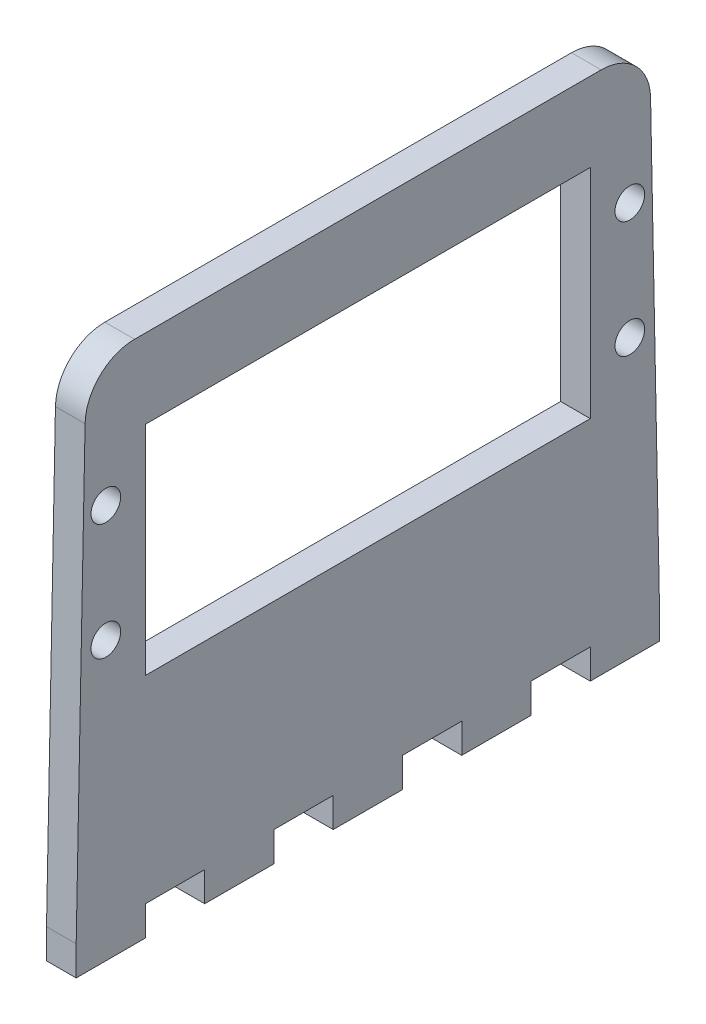
ISO-10303-21;
HEADER;
FILE_DESCRIPTION(('STEP AP214'),'2;1');
FILE_NAME('part.step','',(''),(''),'','','');
FILE_SCHEMA(('AUTOMOTIVE_DESIGN { 1 0 10303 214 1 1 1 1 }'));
ENDSEC;
DATA;
#1=APPLICATION_CONTEXT('core data for automotive mechanical design processes');
#2=APPLICATION_PROTOCOL_DEFINITION('international standard','automotive_design',2000,#1);
#3=PRODUCT_CONTEXT('',#1,'mechanical');
#4=PRODUCT('Part','Part','',(#3));
#5=PRODUCT_RELATED_PRODUCT_CATEGORY('part','',(#4));
#6=PRODUCT_DEFINITION_FORMATION('','',#4);
#7=PRODUCT_DEFINITION_CONTEXT('part definition',#1,'design');
#8=PRODUCT_DEFINITION('design','',#6,#7);
#9=PRODUCT_DEFINITION_SHAPE('','',#8);
#10=(LENGTH_UNIT() NAMED_UNIT(*) SI_UNIT(.MILLI.,.METRE.));
#11=(NAMED_UNIT(*) PLANE_ANGLE_UNIT() SI_UNIT($,.RADIAN.));
#12=(NAMED_UNIT(*) SI_UNIT($,.STERADIAN.) SOLID_ANGLE_UNIT());
#13=UNCERTAINTY_MEASURE_WITH_UNIT(LENGTH_MEASURE(1.E-05),#10,'distance_accuracy_value','');
#14=(GEOMETRIC_REPRESENTATION_CONTEXT(3) GLOBAL_UNCERTAINTY_ASSIGNED_CONTEXT((#13)) GLOBAL_UNIT_ASSIGNED_CONTEXT((#10,
#11,#12)) REPRESENTATION_CONTEXT('',''));
#15=CARTESIAN_POINT('',(0.,0.,0.));
#16=DIRECTION('',(0.,0.,1.));
#17=DIRECTION('',(1.,0.,0.));
#18=AXIS2_PLACEMENT_3D('',#15,#16,#17);
#19=CARTESIAN_POINT('',(3.,0.,0.));
#20=DIRECTION('',(-1.,0.,0.));
#21=DIRECTION('',(0.,0.,1.));
#22=AXIS2_PLACEMENT_3D('',#19,#20,#21);
#23=PLANE('',#22);
#24=DIRECTION('',(0.,0.,1.));
#25=VECTOR('',#24,1.);
#26=CARTESIAN_POINT('',(3.,50.,32.));
#27=LINE('',#26,#25);
#28=CARTESIAN_POINT('',(3.,50.,-20.09900009998));
#29=VERTEX_POINT('',#28);
#30=CARTESIAN_POINT('',(3.,50.,27.09900009998));
#31=VERTEX_POINT('',#30);
#32=EDGE_CURVE('E307',#29,#31,#27,.T.);
#33=ORIENTED_EDGE('',*,*,#32,.T.);
#34=CARTESIAN_POINT('',(3.,45.,27.09900009998));
#35=DIRECTION('',(-1.,0.,0.));
#36=DIRECTION('',(0.,0.,1.));
#37=AXIS2_PLACEMENT_3D('',#34,#35,#36);
#38=CIRCLE('',#37,5.);
#39=CARTESIAN_POINT('',(3.,45.099980005998,32.0980003998801));
#40=VERTEX_POINT('',#39);
#41=EDGE_CURVE('E41',#31,#40,#38,.F.);
#42=ORIENTED_EDGE('',*,*,#41,.T.);
#43=DIRECTION('',(0.,-0.999800059980007,0.0199960011996028));
#44=VECTOR('',#43,1.);
#45=CARTESIAN_POINT('',(3.,0.,33.0000000000001));
#46=LINE('',#45,#44);
#47=CARTESIAN_POINT('',(3.,0.,33.0000000000001));
#48=VERTEX_POINT('',#47);
#49=EDGE_CURVE('E309',#40,#48,#46,.T.);
#50=ORIENTED_EDGE('',*,*,#49,.T.);
#51=DIRECTION('',(0.,-1.,0.));
#52=VECTOR('',#51,1.);
#53=CARTESIAN_POINT('',(3.,-3.,33.0000000000001));
#54=LINE('',#53,#52);
#55=CARTESIAN_POINT('',(3.,-3.,33.0000000000001));
#56=VERTEX_POINT('',#55);
#57=EDGE_CURVE('E265',#48,#56,#54,.T.);
#58=ORIENTED_EDGE('',*,*,#57,.T.);
#59=DIRECTION('',(0.,0.,-1.));
#60=VECTOR('',#59,1.);
#61=CARTESIAN_POINT('',(3.,-3.,26.0000000000001));
#62=LINE('',#61,#60);
#63=CARTESIAN_POINT('',(3.,-3.,26.0000000000001));
#64=VERTEX_POINT('',#63);
#65=EDGE_CURVE('E268',#56,#64,#62,.T.);
#66=ORIENTED_EDGE('',*,*,#65,.T.);
#67=DIRECTION('',(0.,1.,0.));
#68=VECTOR('',#67,1.);
#69=CARTESIAN_POINT('',(3.,0.,26.0000000000001));
#70=LINE('',#69,#68);
#71=CARTESIAN_POINT('',(3.,0.,26.0000000000001));
#72=VERTEX_POINT('',#71);
#73=EDGE_CURVE('E271',#64,#72,#70,.T.);
#74=ORIENTED_EDGE('',*,*,#73,.T.);
#75=DIRECTION('',(0.,0.,-1.));
#76=VECTOR('',#75,1.);
#77=CARTESIAN_POINT('',(3.,0.,20.0000000000001));
#78=LINE('',#77,#76);
#79=CARTESIAN_POINT('',(3.,0.,20.0000000000001));
#80=VERTEX_POINT('',#79);
#81=EDGE_CURVE('E273',#72,#80,#78,.T.);
#82=ORIENTED_EDGE('',*,*,#81,.T.);
#83=DIRECTION('',(0.,-1.,0.));
#84=VECTOR('',#83,1.);
#85=CARTESIAN_POINT('',(3.,-3.,20.0000000000001));
#86=LINE('',#85,#84);
#87=CARTESIAN_POINT('',(3.,-3.,20.0000000000001));
#88=VERTEX_POINT('',#87);
#89=EDGE_CURVE('E275',#80,#88,#86,.T.);
#90=ORIENTED_EDGE('',*,*,#89,.T.);
#91=DIRECTION('',(0.,0.,-1.));
#92=VECTOR('',#91,1.);
#93=CARTESIAN_POINT('',(3.,-3.,13.0000000000001));
#94=LINE('',#93,#92);
#95=CARTESIAN_POINT('',(3.,-3.,13.0000000000001));
#96=VERTEX_POINT('',#95);
#97=EDGE_CURVE('E277',#88,#96,#94,.T.);
#98=ORIENTED_EDGE('',*,*,#97,.T.);
#99=DIRECTION('',(0.,1.,0.));
#100=VECTOR('',#99,1.);
#101=CARTESIAN_POINT('',(3.,0.,13.0000000000001));
#102=LINE('',#101,#100);
#103=CARTESIAN_POINT('',(3.,0.,13.0000000000001));
#104=VERTEX_POINT('',#103);
#105=EDGE_CURVE('E279',#96,#104,#102,.T.);
#106=ORIENTED_EDGE('',*,*,#105,.T.);
#107=DIRECTION('',(0.,0.,-1.));
#108=VECTOR('',#107,1.);
#109=CARTESIAN_POINT('',(3.,0.,7.00000000000027));
#110=LINE('',#109,#108);
#111=CARTESIAN_POINT('',(3.,0.,7.00000000000027));
#112=VERTEX_POINT('',#111);
#113=EDGE_CURVE('E281',#104,#112,#110,.T.);
#114=ORIENTED_EDGE('',*,*,#113,.T.);
#115=DIRECTION('',(0.,-1.,0.));
#116=VECTOR('',#115,1.);
#117=CARTESIAN_POINT('',(3.,-3.,7.00000000000018));
#118=LINE('',#117,#116);
#119=CARTESIAN_POINT('',(3.,-3.,7.00000000000018));
#120=VERTEX_POINT('',#119);
#121=EDGE_CURVE('E283',#112,#120,#118,.T.);
#122=ORIENTED_EDGE('',*,*,#121,.T.);
#123=DIRECTION('',(0.,0.,-1.));
#124=VECTOR('',#123,1.);
#125=CARTESIAN_POINT('',(3.,-3.,0.));
#126=LINE('',#125,#124);
#127=CARTESIAN_POINT('',(3.,-3.,0.));
#128=VERTEX_POINT('',#127);
#129=EDGE_CURVE('E285',#120,#128,#126,.T.);
#130=ORIENTED_EDGE('',*,*,#129,.T.);
#131=DIRECTION('',(0.,1.,0.));
#132=VECTOR('',#131,1.);
#133=CARTESIAN_POINT('',(3.,0.,0.));
#134=LINE('',#133,#132);
#135=CARTESIAN_POINT('',(3.,0.,0.));
#136=VERTEX_POINT('',#135);
#137=EDGE_CURVE('E287',#128,#136,#134,.T.);
#138=ORIENTED_EDGE('',*,*,#137,.T.);
#139=DIRECTION('',(0.,0.,-1.));
#140=VECTOR('',#139,1.);
#141=CARTESIAN_POINT('',(3.,0.,-6.00000000000001));
#142=LINE('',#141,#140);
#143=CARTESIAN_POINT('',(3.,0.,-6.00000000000001));
#144=VERTEX_POINT('',#143);
#145=EDGE_CURVE('E289',#136,#144,#142,.T.);
#146=ORIENTED_EDGE('',*,*,#145,.T.);
#147=DIRECTION('',(0.,-1.,0.));
#148=VECTOR('',#147,1.);
#149=CARTESIAN_POINT('',(3.,-3.,-6.00000000000001));
#150=LINE('',#149,#148);
#151=CARTESIAN_POINT('',(3.,-3.,-6.00000000000001));
#152=VERTEX_POINT('',#151);
#153=EDGE_CURVE('E291',#144,#152,#150,.T.);
#154=ORIENTED_EDGE('',*,*,#153,.T.);
#155=DIRECTION('',(0.,0.,-1.));
#156=VECTOR('',#155,1.);
#157=CARTESIAN_POINT('',(3.,-3.,-13.));
#158=LINE('',#157,#156);
#159=CARTESIAN_POINT('',(3.,-3.,-13.));
#160=VERTEX_POINT('',#159);
#161=EDGE_CURVE('E293',#152,#160,#158,.T.);
#162=ORIENTED_EDGE('',*,*,#161,.T.);
#163=DIRECTION('',(0.,1.,0.));
#164=VECTOR('',#163,1.);
#165=CARTESIAN_POINT('',(3.,0.,-13.));
#166=LINE('',#165,#164);
#167=CARTESIAN_POINT('',(3.,0.,-13.));
#168=VERTEX_POINT('',#167);
#169=EDGE_CURVE('E295',#160,#168,#166,.T.);
#170=ORIENTED_EDGE('',*,*,#169,.T.);
#171=DIRECTION('',(0.,0.,-1.));
#172=VECTOR('',#171,1.);
#173=CARTESIAN_POINT('',(3.,0.,-19.));
#174=LINE('',#173,#172);
#175=CARTESIAN_POINT('',(3.,0.,-19.));
#176=VERTEX_POINT('',#175);
#177=EDGE_CURVE('E297',#168,#176,#174,.T.);
#178=ORIENTED_EDGE('',*,*,#177,.T.);
#179=DIRECTION('',(0.,-1.,0.));
#180=VECTOR('',#179,1.);
#181=CARTESIAN_POINT('',(3.,-3.,-19.));
#182=LINE('',#181,#180);
#183=CARTESIAN_POINT('',(3.,-3.,-19.));
#184=VERTEX_POINT('',#183);
#185=EDGE_CURVE('E299',#176,#184,#182,.T.);
#186=ORIENTED_EDGE('',*,*,#185,.T.);
#187=DIRECTION('',(0.,0.,-1.));
#188=VECTOR('',#187,1.);
#189=CARTESIAN_POINT('',(3.,-3.,-26.));
#190=LINE('',#189,#188);
#191=CARTESIAN_POINT('',(3.,-3.,-26.));
#192=VERTEX_POINT('',#191);
#193=EDGE_CURVE('E301',#184,#192,#190,.T.);
#194=ORIENTED_EDGE('',*,*,#193,.T.);
#195=DIRECTION('',(0.,1.,0.));
#196=VECTOR('',#195,1.);
#197=CARTESIAN_POINT('',(3.,0.,-26.0000000000001));
#198=LINE('',#197,#196);
#199=CARTESIAN_POINT('',(3.,0.,-26.0000000000001));
#200=VERTEX_POINT('',#199);
#201=EDGE_CURVE('E303',#192,#200,#198,.T.);
#202=ORIENTED_EDGE('',*,*,#201,.T.);
#203=DIRECTION('',(0.,0.999800059980007,0.0199960011996018));
#204=VECTOR('',#203,1.);
#205=CARTESIAN_POINT('',(3.,50.,-25.));
#206=LINE('',#205,#204);
#207=CARTESIAN_POINT('',(3.,45.099980005998,-25.09800039988));
#208=VERTEX_POINT('',#207);
#209=EDGE_CURVE('E305',#200,#208,#206,.T.);
#210=ORIENTED_EDGE('',*,*,#209,.T.);
#211=CARTESIAN_POINT('',(3.,45.,-20.09900009998));
#212=DIRECTION('',(-1.,0.,0.));
#213=DIRECTION('',(0.,0.,1.));
#214=AXIS2_PLACEMENT_3D('',#211,#212,#213);
#215=CIRCLE('',#214,5.);
#216=EDGE_CURVE('E425',#208,#29,#215,.F.);
#217=ORIENTED_EDGE('',*,*,#216,.T.);
#218=EDGE_LOOP('',(#33,#42,#50,#58,#66,#74,#82,#90,#98,#106,#114,#122,#130,#138,#146,#154,#162,
#170,#178,#186,#194,#202,#210,#217));
#219=FACE_BOUND('',#218,.T.);
#220=DIRECTION('',(0.,1.,0.));
#221=VECTOR('',#220,1.);
#222=CARTESIAN_POINT('',(3.,42.,-19.));
#223=LINE('',#222,#221);
#224=CARTESIAN_POINT('',(3.,20.,-19.));
#225=VERTEX_POINT('',#224);
#226=CARTESIAN_POINT('',(3.,42.,-19.));
#227=VERTEX_POINT('',#226);
#228=EDGE_CURVE('E221',#225,#227,#223,.T.);
#229=ORIENTED_EDGE('',*,*,#228,.F.);
#230=DIRECTION('',(0.,0.,-1.));
#231=VECTOR('',#230,1.);
#232=CARTESIAN_POINT('',(3.,20.,26.));
#233=LINE('',#232,#231);
#234=CARTESIAN_POINT('',(3.,20.,26.));
#235=VERTEX_POINT('',#234);
#236=EDGE_CURVE('E247',#235,#225,#233,.T.);
#237=ORIENTED_EDGE('',*,*,#236,.F.);
#238=DIRECTION('',(0.,-1.,0.));
#239=VECTOR('',#238,1.);
#240=CARTESIAN_POINT('',(3.,42.,26.));
#241=LINE('',#240,#239);
#242=CARTESIAN_POINT('',(3.,42.,26.));
#243=VERTEX_POINT('',#242);
#244=EDGE_CURVE('E245',#243,#235,#241,.T.);
#245=ORIENTED_EDGE('',*,*,#244,.F.);
#246=DIRECTION('',(0.,0.,1.));
#247=VECTOR('',#246,1.);
#248=CARTESIAN_POINT('',(3.,42.,26.));
#249=LINE('',#248,#247);
#250=EDGE_CURVE('E231',#227,#243,#249,.T.);
#251=ORIENTED_EDGE('',*,*,#250,.F.);
#252=EDGE_LOOP('',(#229,#237,#245,#251));
#253=FACE_BOUND('',#252,.T.);
#254=CARTESIAN_POINT('',(3.,36.9,-23.));
#255=DIRECTION('',(1.,0.,0.));
#256=DIRECTION('',(0.,0.,-1.));
#257=AXIS2_PLACEMENT_3D('',#254,#255,#256);
#258=CIRCLE('',#257,1.5);
#259=CARTESIAN_POINT('',(3.,36.9,-24.5));
#260=VERTEX_POINT('',#259);
#261=EDGE_CURVE('E254',#260,#260,#258,.T.);
#262=ORIENTED_EDGE('',*,*,#261,.F.);
#263=EDGE_LOOP('',(#262));
#264=FACE_BOUND('',#263,.T.);
#265=CARTESIAN_POINT('',(3.,25.1,-23.));
#266=DIRECTION('',(1.,0.,0.));
#267=DIRECTION('',(0.,0.,1.));
#268=AXIS2_PLACEMENT_3D('',#265,#266,#267);
#269=CIRCLE('',#268,1.5);
#270=CARTESIAN_POINT('',(3.,25.1,-21.5));
#271=VERTEX_POINT('',#270);
#272=EDGE_CURVE('E840',#271,#271,#269,.T.);
#273=ORIENTED_EDGE('',*,*,#272,.F.);
#274=EDGE_LOOP('',(#273));
#275=FACE_BOUND('',#274,.T.);
#276=CARTESIAN_POINT('',(3.,36.9,30.));
#277=DIRECTION('',(1.,0.,0.));
#278=DIRECTION('',(0.,0.,1.));
#279=AXIS2_PLACEMENT_3D('',#276,#277,#278);
#280=CIRCLE('',#279,1.5);
#281=CARTESIAN_POINT('',(3.,36.9,31.5));
#282=VERTEX_POINT('',#281);
#283=EDGE_CURVE('E834',#282,#282,#280,.T.);
#284=ORIENTED_EDGE('',*,*,#283,.F.);
#285=EDGE_LOOP('',(#284));
#286=FACE_BOUND('',#285,.T.);
#287=CARTESIAN_POINT('',(3.,25.1,30.));
#288=DIRECTION('',(1.,0.,0.));
#289=DIRECTION('',(0.,0.,-1.));
#290=AXIS2_PLACEMENT_3D('',#287,#288,#289);
#291=CIRCLE('',#290,1.5);
#292=CARTESIAN_POINT('',(3.,25.1,28.5));
#293=VERTEX_POINT('',#292);
#294=EDGE_CURVE('E825',#293,#293,#291,.T.);
#295=ORIENTED_EDGE('',*,*,#294,.F.);
#296=EDGE_LOOP('',(#295));
#297=FACE_BOUND('',#296,.T.);
#298=ADVANCED_FACE('F33',(#219,#253,#264,#275,#286,#297),#23,.F.);
#299=CARTESIAN_POINT('',(0.,0.,0.));
#300=DIRECTION('',(-1.,0.,0.));
#301=DIRECTION('',(0.,0.,1.));
#302=AXIS2_PLACEMENT_3D('',#299,#300,#301);
#303=PLANE('',#302);
#304=CARTESIAN_POINT('',(0.,36.9,30.));
#305=DIRECTION('',(1.,0.,0.));
#306=DIRECTION('',(0.,0.,1.));
#307=AXIS2_PLACEMENT_3D('',#304,#305,#306);
#308=CIRCLE('',#307,1.5);
#309=CARTESIAN_POINT('',(0.,36.9,31.5));
#310=VERTEX_POINT('',#309);
#311=EDGE_CURVE('E831',#310,#310,#308,.T.);
#312=ORIENTED_EDGE('',*,*,#311,.T.);
#313=EDGE_LOOP('',(#312));
#314=FACE_BOUND('',#313,.T.);
#315=CARTESIAN_POINT('',(0.,36.9,-23.));
#316=DIRECTION('',(1.,0.,0.));
#317=DIRECTION('',(0.,0.,-1.));
#318=AXIS2_PLACEMENT_3D('',#315,#316,#317);
#319=CIRCLE('',#318,1.5);
#320=CARTESIAN_POINT('',(0.,36.9,-24.5));
#321=VERTEX_POINT('',#320);
#322=EDGE_CURVE('E843',#321,#321,#319,.T.);
#323=ORIENTED_EDGE('',*,*,#322,.T.);
#324=EDGE_LOOP('',(#323));
#325=FACE_BOUND('',#324,.T.);
#326=DIRECTION('',(0.,-0.999800059980007,0.0199960011996028));
#327=VECTOR('',#326,1.);
#328=CARTESIAN_POINT('',(0.,0.,33.0000000000001));
#329=LINE('',#328,#327);
#330=CARTESIAN_POINT('',(0.,45.099980005998,32.0980003998801));
#331=VERTEX_POINT('',#330);
#332=CARTESIAN_POINT('',(0.,0.,33.0000000000001));
#333=VERTEX_POINT('',#332);
#334=EDGE_CURVE('E269',#331,#333,#329,.T.);
#335=ORIENTED_EDGE('',*,*,#334,.F.);
#336=CARTESIAN_POINT('',(0.,45.,27.09900009998));
#337=DIRECTION('',(-1.,0.,0.));
#338=DIRECTION('',(0.,0.,1.));
#339=AXIS2_PLACEMENT_3D('',#336,#337,#338);
#340=CIRCLE('',#339,5.);
#341=CARTESIAN_POINT('',(0.,50.,27.09900009998));
#342=VERTEX_POINT('',#341);
#343=EDGE_CURVE('E419',#331,#342,#340,.T.);
#344=ORIENTED_EDGE('',*,*,#343,.T.);
#345=DIRECTION('',(0.,0.,1.));
#346=VECTOR('',#345,1.);
#347=CARTESIAN_POINT('',(0.,50.,32.));
#348=LINE('',#347,#346);
#349=CARTESIAN_POINT('',(0.,50.,-20.09900009998));
#350=VERTEX_POINT('',#349);
#351=EDGE_CURVE('E352',#350,#342,#348,.T.);
#352=ORIENTED_EDGE('',*,*,#351,.F.);
#353=CARTESIAN_POINT('',(0.,45.,-20.09900009998));
#354=DIRECTION('',(-1.,0.,0.));
#355=DIRECTION('',(0.,0.,1.));
#356=AXIS2_PLACEMENT_3D('',#353,#354,#355);
#357=CIRCLE('',#356,5.);
#358=CARTESIAN_POINT('',(0.,45.099980005998,-25.09800039988));
#359=VERTEX_POINT('',#358);
#360=EDGE_CURVE('E417',#350,#359,#357,.T.);
#361=ORIENTED_EDGE('',*,*,#360,.T.);
#362=DIRECTION('',(0.,0.999800059980007,0.0199960011996018));
#363=VECTOR('',#362,1.);
#364=CARTESIAN_POINT('',(0.,50.,-25.));
#365=LINE('',#364,#363);
#366=CARTESIAN_POINT('',(0.,0.,-26.0000000000001));
#367=VERTEX_POINT('',#366);
#368=EDGE_CURVE('E350',#367,#359,#365,.T.);
#369=ORIENTED_EDGE('',*,*,#368,.F.);
#370=DIRECTION('',(0.,1.,0.));
#371=VECTOR('',#370,1.);
#372=CARTESIAN_POINT('',(0.,0.,-26.0000000000001));
#373=LINE('',#372,#371);
#374=CARTESIAN_POINT('',(0.,-3.,-26.));
#375=VERTEX_POINT('',#374);
#376=EDGE_CURVE('E348',#375,#367,#373,.T.);
#377=ORIENTED_EDGE('',*,*,#376,.F.);
#378=DIRECTION('',(0.,0.,-1.));
#379=VECTOR('',#378,1.);
#380=CARTESIAN_POINT('',(0.,-3.,-26.));
#381=LINE('',#380,#379);
#382=CARTESIAN_POINT('',(0.,-3.,-19.));
#383=VERTEX_POINT('',#382);
#384=EDGE_CURVE('E346',#383,#375,#381,.T.);
#385=ORIENTED_EDGE('',*,*,#384,.F.);
#386=DIRECTION('',(0.,-1.,0.));
#387=VECTOR('',#386,1.);
#388=CARTESIAN_POINT('',(0.,-3.,-19.));
#389=LINE('',#388,#387);
#390=CARTESIAN_POINT('',(0.,0.,-19.));
#391=VERTEX_POINT('',#390);
#392=EDGE_CURVE('E344',#391,#383,#389,.T.);
#393=ORIENTED_EDGE('',*,*,#392,.F.);
#394=DIRECTION('',(0.,0.,-1.));
#395=VECTOR('',#394,1.);
#396=CARTESIAN_POINT('',(0.,0.,-19.));
#397=LINE('',#396,#395);
#398=CARTESIAN_POINT('',(0.,0.,-13.));
#399=VERTEX_POINT('',#398);
#400=EDGE_CURVE('E342',#399,#391,#397,.T.);
#401=ORIENTED_EDGE('',*,*,#400,.F.);
#402=DIRECTION('',(0.,1.,0.));
#403=VECTOR('',#402,1.);
#404=CARTESIAN_POINT('',(0.,0.,-13.));
#405=LINE('',#404,#403);
#406=CARTESIAN_POINT('',(0.,-3.,-13.));
#407=VERTEX_POINT('',#406);
#408=EDGE_CURVE('E340',#407,#399,#405,.T.);
#409=ORIENTED_EDGE('',*,*,#408,.F.);
#410=DIRECTION('',(0.,0.,-1.));
#411=VECTOR('',#410,1.);
#412=CARTESIAN_POINT('',(0.,-3.,-13.));
#413=LINE('',#412,#411);
#414=CARTESIAN_POINT('',(0.,-3.,-6.00000000000001));
#415=VERTEX_POINT('',#414);
#416=EDGE_CURVE('E338',#415,#407,#413,.T.);
#417=ORIENTED_EDGE('',*,*,#416,.F.);
#418=DIRECTION('',(0.,-1.,0.));
#419=VECTOR('',#418,1.);
#420=CARTESIAN_POINT('',(0.,-3.,-6.00000000000001));
#421=LINE('',#420,#419);
#422=CARTESIAN_POINT('',(0.,0.,-6.00000000000001));
#423=VERTEX_POINT('',#422);
#424=EDGE_CURVE('E336',#423,#415,#421,.T.);
#425=ORIENTED_EDGE('',*,*,#424,.F.);
#426=DIRECTION('',(0.,0.,-1.));
#427=VECTOR('',#426,1.);
#428=CARTESIAN_POINT('',(0.,0.,-6.00000000000001));
#429=LINE('',#428,#427);
#430=CARTESIAN_POINT('',(0.,0.,0.));
#431=VERTEX_POINT('',#430);
#432=EDGE_CURVE('E334',#431,#423,#429,.T.);
#433=ORIENTED_EDGE('',*,*,#432,.F.);
#434=DIRECTION('',(0.,1.,0.));
#435=VECTOR('',#434,1.);
#436=CARTESIAN_POINT('',(0.,0.,0.));
#437=LINE('',#436,#435);
#438=CARTESIAN_POINT('',(0.,-3.,0.));
#439=VERTEX_POINT('',#438);
#440=EDGE_CURVE('E332',#439,#431,#437,.T.);
#441=ORIENTED_EDGE('',*,*,#440,.F.);
#442=DIRECTION('',(0.,0.,-1.));
#443=VECTOR('',#442,1.);
#444=CARTESIAN_POINT('',(0.,-3.,0.));
#445=LINE('',#444,#443);
#446=CARTESIAN_POINT('',(0.,-3.,7.00000000000018));
#447=VERTEX_POINT('',#446);
#448=EDGE_CURVE('E330',#447,#439,#445,.T.);
#449=ORIENTED_EDGE('',*,*,#448,.F.);
#450=DIRECTION('',(0.,-1.,0.));
#451=VECTOR('',#450,1.);
#452=CARTESIAN_POINT('',(0.,-3.,7.00000000000018));
#453=LINE('',#452,#451);
#454=CARTESIAN_POINT('',(0.,0.,7.00000000000027));
#455=VERTEX_POINT('',#454);
#456=EDGE_CURVE('E328',#455,#447,#453,.T.);
#457=ORIENTED_EDGE('',*,*,#456,.F.);
#458=DIRECTION('',(0.,0.,-1.));
#459=VECTOR('',#458,1.);
#460=CARTESIAN_POINT('',(0.,0.,7.00000000000027));
#461=LINE('',#460,#459);
#462=CARTESIAN_POINT('',(0.,0.,13.0000000000001));
#463=VERTEX_POINT('',#462);
#464=EDGE_CURVE('E326',#463,#455,#461,.T.);
#465=ORIENTED_EDGE('',*,*,#464,.F.);
#466=DIRECTION('',(0.,1.,0.));
#467=VECTOR('',#466,1.);
#468=CARTESIAN_POINT('',(0.,0.,13.0000000000001));
#469=LINE('',#468,#467);
#470=CARTESIAN_POINT('',(0.,-3.,13.0000000000001));
#471=VERTEX_POINT('',#470);
#472=EDGE_CURVE('E324',#471,#463,#469,.T.);
#473=ORIENTED_EDGE('',*,*,#472,.F.);
#474=DIRECTION('',(0.,0.,-1.));
#475=VECTOR('',#474,1.);
#476=CARTESIAN_POINT('',(0.,-3.,13.0000000000001));
#477=LINE('',#476,#475);
#478=CARTESIAN_POINT('',(0.,-3.,20.0000000000001));
#479=VERTEX_POINT('',#478);
#480=EDGE_CURVE('E322',#479,#471,#477,.T.);
#481=ORIENTED_EDGE('',*,*,#480,.F.);
#482=DIRECTION('',(0.,-1.,0.));
#483=VECTOR('',#482,1.);
#484=CARTESIAN_POINT('',(0.,-3.,20.0000000000001));
#485=LINE('',#484,#483);
#486=CARTESIAN_POINT('',(0.,0.,20.0000000000001));
#487=VERTEX_POINT('',#486);
#488=EDGE_CURVE('E320',#487,#479,#485,.T.);
#489=ORIENTED_EDGE('',*,*,#488,.F.);
#490=DIRECTION('',(0.,0.,-1.));
#491=VECTOR('',#490,1.);
#492=CARTESIAN_POINT('',(0.,0.,20.0000000000001));
#493=LINE('',#492,#491);
#494=CARTESIAN_POINT('',(0.,0.,26.0000000000001));
#495=VERTEX_POINT('',#494);
#496=EDGE_CURVE('E318',#495,#487,#493,.T.);
#497=ORIENTED_EDGE('',*,*,#496,.F.);
#498=DIRECTION('',(0.,1.,0.));
#499=VECTOR('',#498,1.);
#500=CARTESIAN_POINT('',(0.,0.,26.0000000000001));
#501=LINE('',#500,#499);
#502=CARTESIAN_POINT('',(0.,-3.,26.0000000000001));
#503=VERTEX_POINT('',#502);
#504=EDGE_CURVE('E316',#503,#495,#501,.T.);
#505=ORIENTED_EDGE('',*,*,#504,.F.);
#506=DIRECTION('',(0.,0.,-1.));
#507=VECTOR('',#506,1.);
#508=CARTESIAN_POINT('',(0.,-3.,26.0000000000001));
#509=LINE('',#508,#507);
#510=CARTESIAN_POINT('',(0.,-3.,33.0000000000001));
#511=VERTEX_POINT('',#510);
#512=EDGE_CURVE('E314',#511,#503,#509,.T.);
#513=ORIENTED_EDGE('',*,*,#512,.F.);
#514=DIRECTION('',(0.,-1.,0.));
#515=VECTOR('',#514,1.);
#516=CARTESIAN_POINT('',(0.,-3.,33.0000000000001));
#517=LINE('',#516,#515);
#518=EDGE_CURVE('E239',#333,#511,#517,.T.);
#519=ORIENTED_EDGE('',*,*,#518,.F.);
#520=EDGE_LOOP('',(#335,#344,#352,#361,#369,#377,#385,#393,#401,#409,#417,#425,#433,#441,#449,
#457,#465,#473,#481,#489,#497,#505,#513,#519));
#521=FACE_BOUND('',#520,.T.);
#522=DIRECTION('',(0.,0.,-1.));
#523=VECTOR('',#522,1.);
#524=CARTESIAN_POINT('',(0.,20.,26.));
#525=LINE('',#524,#523);
#526=CARTESIAN_POINT('',(0.,20.,26.));
#527=VERTEX_POINT('',#526);
#528=CARTESIAN_POINT('',(0.,20.,-19.));
#529=VERTEX_POINT('',#528);
#530=EDGE_CURVE('E232',#527,#529,#525,.T.);
#531=ORIENTED_EDGE('',*,*,#530,.T.);
#532=DIRECTION('',(0.,1.,0.));
#533=VECTOR('',#532,1.);
#534=CARTESIAN_POINT('',(0.,42.,-19.));
#535=LINE('',#534,#533);
#536=CARTESIAN_POINT('',(0.,42.,-19.));
#537=VERTEX_POINT('',#536);
#538=EDGE_CURVE('E252',#529,#537,#535,.T.);
#539=ORIENTED_EDGE('',*,*,#538,.T.);
#540=DIRECTION('',(0.,0.,1.));
#541=VECTOR('',#540,1.);
#542=CARTESIAN_POINT('',(0.,42.,26.));
#543=LINE('',#542,#541);
#544=CARTESIAN_POINT('',(0.,42.,26.));
#545=VERTEX_POINT('',#544);
#546=EDGE_CURVE('E238',#537,#545,#543,.T.);
#547=ORIENTED_EDGE('',*,*,#546,.T.);
#548=DIRECTION('',(0.,-1.,0.));
#549=VECTOR('',#548,1.);
#550=CARTESIAN_POINT('',(0.,42.,26.));
#551=LINE('',#550,#549);
#552=EDGE_CURVE('E256',#545,#527,#551,.T.);
#553=ORIENTED_EDGE('',*,*,#552,.T.);
#554=EDGE_LOOP('',(#531,#539,#547,#553));
#555=FACE_BOUND('',#554,.T.);
#556=CARTESIAN_POINT('',(0.,25.1,-23.));
#557=DIRECTION('',(1.,0.,0.));
#558=DIRECTION('',(0.,0.,1.));
#559=AXIS2_PLACEMENT_3D('',#556,#557,#558);
#560=CIRCLE('',#559,1.5);
#561=CARTESIAN_POINT('',(0.,25.1,-21.5));
#562=VERTEX_POINT('',#561);
#563=EDGE_CURVE('E837',#562,#562,#560,.T.);
#564=ORIENTED_EDGE('',*,*,#563,.T.);
#565=EDGE_LOOP('',(#564));
#566=FACE_BOUND('',#565,.T.);
#567=CARTESIAN_POINT('',(0.,25.1,30.));
#568=DIRECTION('',(1.,0.,0.));
#569=DIRECTION('',(0.,0.,-1.));
#570=AXIS2_PLACEMENT_3D('',#567,#568,#569);
#571=CIRCLE('',#570,1.5);
#572=CARTESIAN_POINT('',(0.,25.1,28.5));
#573=VERTEX_POINT('',#572);
#574=EDGE_CURVE('E828',#573,#573,#571,.T.);
#575=ORIENTED_EDGE('',*,*,#574,.T.);
#576=EDGE_LOOP('',(#575));
#577=FACE_BOUND('',#576,.T.);
#578=ADVANCED_FACE('F439',(#314,#325,#521,#555,#566,#577),#303,.T.);
#579=CARTESIAN_POINT('',(3.,-3.,33.0000000000001));
#580=DIRECTION('',(0.,0.,-1.));
#581=DIRECTION('',(0.,1.,0.));
#582=AXIS2_PLACEMENT_3D('',#579,#580,#581);
#583=PLANE('',#582);
#584=ORIENTED_EDGE('',*,*,#518,.T.);
#585=DIRECTION('',(-1.,0.,0.));
#586=VECTOR('',#585,1.);
#587=CARTESIAN_POINT('',(3.,-3.,33.0000000000001));
#588=LINE('',#587,#586);
#589=EDGE_CURVE('E411',#56,#511,#588,.T.);
#590=ORIENTED_EDGE('',*,*,#589,.F.);
#591=ORIENTED_EDGE('',*,*,#57,.F.);
#592=DIRECTION('',(-1.,0.,0.));
#593=VECTOR('',#592,1.);
#594=CARTESIAN_POINT('',(3.,0.,33.0000000000001));
#595=LINE('',#594,#593);
#596=EDGE_CURVE('E311',#48,#333,#595,.T.);
#597=ORIENTED_EDGE('',*,*,#596,.T.);
#598=EDGE_LOOP('',(#584,#590,#591,#597));
#599=FACE_BOUND('',#598,.T.);
#600=ADVANCED_FACE('F538',(#599),#583,.F.);
#601=CARTESIAN_POINT('',(3.,-3.,26.0000000000001));
#602=DIRECTION('',(0.,1.,0.));
#603=DIRECTION('',(0.,0.,1.));
#604=AXIS2_PLACEMENT_3D('',#601,#602,#603);
#605=PLANE('',#604);
#606=ORIENTED_EDGE('',*,*,#512,.T.);
#607=DIRECTION('',(-1.,0.,0.));
#608=VECTOR('',#607,1.);
#609=CARTESIAN_POINT('',(3.,-3.,26.0000000000001));
#610=LINE('',#609,#608);
#611=EDGE_CURVE('E408',#64,#503,#610,.T.);
#612=ORIENTED_EDGE('',*,*,#611,.F.);
#613=ORIENTED_EDGE('',*,*,#65,.F.);
#614=ORIENTED_EDGE('',*,*,#589,.T.);
#615=EDGE_LOOP('',(#606,#612,#613,#614));
#616=FACE_BOUND('',#615,.T.);
#617=ADVANCED_FACE('F535',(#616),#605,.F.);
#618=CARTESIAN_POINT('',(3.,0.,26.0000000000001));
#619=DIRECTION('',(0.,0.,1.));
#620=DIRECTION('',(1.,0.,0.));
#621=AXIS2_PLACEMENT_3D('',#618,#619,#620);
#622=PLANE('',#621);
#623=ORIENTED_EDGE('',*,*,#504,.T.);
#624=DIRECTION('',(-1.,0.,0.));
#625=VECTOR('',#624,1.);
#626=CARTESIAN_POINT('',(3.,0.,26.0000000000001));
#627=LINE('',#626,#625);
#628=EDGE_CURVE('E405',#72,#495,#627,.T.);
#629=ORIENTED_EDGE('',*,*,#628,.F.);
#630=ORIENTED_EDGE('',*,*,#73,.F.);
#631=ORIENTED_EDGE('',*,*,#611,.T.);
#632=EDGE_LOOP('',(#623,#629,#630,#631));
#633=FACE_BOUND('',#632,.T.);
#634=ADVANCED_FACE('F531',(#633),#622,.F.);
#635=CARTESIAN_POINT('',(3.,0.,20.0000000000001));
#636=DIRECTION('',(0.,1.,0.));
#637=DIRECTION('',(0.,0.,1.));
#638=AXIS2_PLACEMENT_3D('',#635,#636,#637);
#639=PLANE('',#638);
#640=ORIENTED_EDGE('',*,*,#496,.T.);
#641=DIRECTION('',(-1.,0.,0.));
#642=VECTOR('',#641,1.);
#643=CARTESIAN_POINT('',(3.,0.,20.0000000000001));
#644=LINE('',#643,#642);
#645=EDGE_CURVE('E402',#80,#487,#644,.T.);
#646=ORIENTED_EDGE('',*,*,#645,.F.);
#647=ORIENTED_EDGE('',*,*,#81,.F.);
#648=ORIENTED_EDGE('',*,*,#628,.T.);
#649=EDGE_LOOP('',(#640,#646,#647,#648));
#650=FACE_BOUND('',#649,.T.);
#651=ADVANCED_FACE('F527',(#650),#639,.F.);
#652=CARTESIAN_POINT('',(3.,-3.,20.0000000000001));
#653=DIRECTION('',(0.,0.,-1.));
#654=DIRECTION('',(-1.,0.,0.));
#655=AXIS2_PLACEMENT_3D('',#652,#653,#654);
#656=PLANE('',#655);
#657=ORIENTED_EDGE('',*,*,#488,.T.);
#658=DIRECTION('',(-1.,0.,0.));
#659=VECTOR('',#658,1.);
#660=CARTESIAN_POINT('',(3.,-3.,20.0000000000001));
#661=LINE('',#660,#659);
#662=EDGE_CURVE('E399',#88,#479,#661,.T.);
#663=ORIENTED_EDGE('',*,*,#662,.F.);
#664=ORIENTED_EDGE('',*,*,#89,.F.);
#665=ORIENTED_EDGE('',*,*,#645,.T.);
#666=EDGE_LOOP('',(#657,#663,#664,#665));
#667=FACE_BOUND('',#666,.T.);
#668=ADVANCED_FACE('F523',(#667),#656,.F.);
#669=CARTESIAN_POINT('',(3.,-3.,13.0000000000001));
#670=DIRECTION('',(0.,1.,0.));
#671=DIRECTION('',(0.,0.,1.));
#672=AXIS2_PLACEMENT_3D('',#669,#670,#671);
#673=PLANE('',#672);
#674=ORIENTED_EDGE('',*,*,#480,.T.);
#675=DIRECTION('',(-1.,0.,0.));
#676=VECTOR('',#675,1.);
#677=CARTESIAN_POINT('',(3.,-3.,13.0000000000001));
#678=LINE('',#677,#676);
#679=EDGE_CURVE('E396',#96,#471,#678,.T.);
#680=ORIENTED_EDGE('',*,*,#679,.F.);
#681=ORIENTED_EDGE('',*,*,#97,.F.);
#682=ORIENTED_EDGE('',*,*,#662,.T.);
#683=EDGE_LOOP('',(#674,#680,#681,#682));
#684=FACE_BOUND('',#683,.T.);
#685=ADVANCED_FACE('F518',(#684),#673,.F.);
#686=CARTESIAN_POINT('',(3.,0.,13.0000000000001));
#687=DIRECTION('',(0.,0.,1.));
#688=DIRECTION('',(1.,0.,0.));
#689=AXIS2_PLACEMENT_3D('',#686,#687,#688);
#690=PLANE('',#689);
#691=ORIENTED_EDGE('',*,*,#472,.T.);
#692=DIRECTION('',(-1.,0.,0.));
#693=VECTOR('',#692,1.);
#694=CARTESIAN_POINT('',(3.,0.,13.0000000000001));
#695=LINE('',#694,#693);
#696=EDGE_CURVE('E393',#104,#463,#695,.T.);
#697=ORIENTED_EDGE('',*,*,#696,.F.);
#698=ORIENTED_EDGE('',*,*,#105,.F.);
#699=ORIENTED_EDGE('',*,*,#679,.T.);
#700=EDGE_LOOP('',(#691,#697,#698,#699));
#701=FACE_BOUND('',#700,.T.);
#702=ADVANCED_FACE('F512',(#701),#690,.F.);
#703=CARTESIAN_POINT('',(3.,0.,7.00000000000027));
#704=DIRECTION('',(0.,1.,0.));
#705=DIRECTION('',(0.,0.,1.));
#706=AXIS2_PLACEMENT_3D('',#703,#704,#705);
#707=PLANE('',#706);
#708=ORIENTED_EDGE('',*,*,#464,.T.);
#709=DIRECTION('',(-1.,0.,0.));
#710=VECTOR('',#709,1.);
#711=CARTESIAN_POINT('',(3.,0.,7.00000000000027));
#712=LINE('',#711,#710);
#713=EDGE_CURVE('E390',#112,#455,#712,.T.);
#714=ORIENTED_EDGE('',*,*,#713,.F.);
#715=ORIENTED_EDGE('',*,*,#113,.F.);
#716=ORIENTED_EDGE('',*,*,#696,.T.);
#717=EDGE_LOOP('',(#708,#714,#715,#716));
#718=FACE_BOUND('',#717,.T.);
#719=ADVANCED_FACE('F508',(#718),#707,.F.);
#720=CARTESIAN_POINT('',(3.,-3.,7.00000000000018));
#721=DIRECTION('',(0.,0.,-1.));
#722=DIRECTION('',(0.,1.,0.));
#723=AXIS2_PLACEMENT_3D('',#720,#721,#722);
#724=PLANE('',#723);
#725=ORIENTED_EDGE('',*,*,#456,.T.);
#726=DIRECTION('',(-1.,0.,0.));
#727=VECTOR('',#726,1.);
#728=CARTESIAN_POINT('',(3.,-3.,7.00000000000018));
#729=LINE('',#728,#727);
#730=EDGE_CURVE('E387',#120,#447,#729,.T.);
#731=ORIENTED_EDGE('',*,*,#730,.F.);
#732=ORIENTED_EDGE('',*,*,#121,.F.);
#733=ORIENTED_EDGE('',*,*,#713,.T.);
#734=EDGE_LOOP('',(#725,#731,#732,#733));
#735=FACE_BOUND('',#734,.T.);
#736=ADVANCED_FACE('F503',(#735),#724,.F.);
#737=CARTESIAN_POINT('',(3.,-3.,0.));
#738=DIRECTION('',(0.,1.,0.));
#739=DIRECTION('',(0.,0.,1.));
#740=AXIS2_PLACEMENT_3D('',#737,#738,#739);
#741=PLANE('',#740);
#742=ORIENTED_EDGE('',*,*,#448,.T.);
#743=DIRECTION('',(-1.,0.,0.));
#744=VECTOR('',#743,1.);
#745=CARTESIAN_POINT('',(3.,-3.,0.));
#746=LINE('',#745,#744);
#747=EDGE_CURVE('E384',#128,#439,#746,.T.);
#748=ORIENTED_EDGE('',*,*,#747,.F.);
#749=ORIENTED_EDGE('',*,*,#129,.F.);
#750=ORIENTED_EDGE('',*,*,#730,.T.);
#751=EDGE_LOOP('',(#742,#748,#749,#750));
#752=FACE_BOUND('',#751,.T.);
#753=ADVANCED_FACE('F497',(#752),#741,.F.);
#754=CARTESIAN_POINT('',(3.,0.,0.));
#755=DIRECTION('',(0.,0.,1.));
#756=DIRECTION('',(0.,-1.,0.));
#757=AXIS2_PLACEMENT_3D('',#754,#755,#756);
#758=PLANE('',#757);
#759=ORIENTED_EDGE('',*,*,#440,.T.);
#760=DIRECTION('',(-1.,0.,0.));
#761=VECTOR('',#760,1.);
#762=CARTESIAN_POINT('',(3.,0.,0.));
#763=LINE('',#762,#761);
#764=EDGE_CURVE('E381',#136,#431,#763,.T.);
#765=ORIENTED_EDGE('',*,*,#764,.F.);
#766=ORIENTED_EDGE('',*,*,#137,.F.);
#767=ORIENTED_EDGE('',*,*,#747,.T.);
#768=EDGE_LOOP('',(#759,#765,#766,#767));
#769=FACE_BOUND('',#768,.T.);
#770=ADVANCED_FACE('F493',(#769),#758,.F.);
#771=CARTESIAN_POINT('',(3.,0.,-6.00000000000001));
#772=DIRECTION('',(0.,1.,0.));
#773=DIRECTION('',(0.,0.,1.));
#774=AXIS2_PLACEMENT_3D('',#771,#772,#773);
#775=PLANE('',#774);
#776=ORIENTED_EDGE('',*,*,#432,.T.);
#777=DIRECTION('',(-1.,0.,0.));
#778=VECTOR('',#777,1.);
#779=CARTESIAN_POINT('',(3.,0.,-6.00000000000001));
#780=LINE('',#779,#778);
#781=EDGE_CURVE('E378',#144,#423,#780,.T.);
#782=ORIENTED_EDGE('',*,*,#781,.F.);
#783=ORIENTED_EDGE('',*,*,#145,.F.);
#784=ORIENTED_EDGE('',*,*,#764,.T.);
#785=EDGE_LOOP('',(#776,#782,#783,#784));
#786=FACE_BOUND('',#785,.T.);
#787=ADVANCED_FACE('F488',(#786),#775,.F.);
#788=CARTESIAN_POINT('',(3.,-3.,-6.00000000000001));
#789=DIRECTION('',(0.,0.,-1.));
#790=DIRECTION('',(-1.,0.,0.));
#791=AXIS2_PLACEMENT_3D('',#788,#789,#790);
#792=PLANE('',#791);
#793=ORIENTED_EDGE('',*,*,#424,.T.);
#794=DIRECTION('',(-1.,0.,0.));
#795=VECTOR('',#794,1.);
#796=CARTESIAN_POINT('',(3.,-3.,-6.00000000000001));
#797=LINE('',#796,#795);
#798=EDGE_CURVE('E375',#152,#415,#797,.T.);
#799=ORIENTED_EDGE('',*,*,#798,.F.);
#800=ORIENTED_EDGE('',*,*,#153,.F.);
#801=ORIENTED_EDGE('',*,*,#781,.T.);
#802=EDGE_LOOP('',(#793,#799,#800,#801));
#803=FACE_BOUND('',#802,.T.);
#804=ADVANCED_FACE('F482',(#803),#792,.F.);
#805=CARTESIAN_POINT('',(3.,-3.,-13.));
#806=DIRECTION('',(0.,1.,0.));
#807=DIRECTION('',(0.,0.,1.));
#808=AXIS2_PLACEMENT_3D('',#805,#806,#807);
#809=PLANE('',#808);
#810=ORIENTED_EDGE('',*,*,#416,.T.);
#811=DIRECTION('',(-1.,0.,0.));
#812=VECTOR('',#811,1.);
#813=CARTESIAN_POINT('',(3.,-3.,-13.));
#814=LINE('',#813,#812);
#815=EDGE_CURVE('E372',#160,#407,#814,.T.);
#816=ORIENTED_EDGE('',*,*,#815,.F.);
#817=ORIENTED_EDGE('',*,*,#161,.F.);
#818=ORIENTED_EDGE('',*,*,#798,.T.);
#819=EDGE_LOOP('',(#810,#816,#817,#818));
#820=FACE_BOUND('',#819,.T.);
#821=ADVANCED_FACE('F478',(#820),#809,.F.);
#822=CARTESIAN_POINT('',(3.,0.,-13.));
#823=DIRECTION('',(0.,0.,1.));
#824=DIRECTION('',(0.,-1.,0.));
#825=AXIS2_PLACEMENT_3D('',#822,#823,#824);
#826=PLANE('',#825);
#827=ORIENTED_EDGE('',*,*,#408,.T.);
#828=DIRECTION('',(-1.,0.,0.));
#829=VECTOR('',#828,1.);
#830=CARTESIAN_POINT('',(3.,0.,-13.));
#831=LINE('',#830,#829);
#832=EDGE_CURVE('E369',#168,#399,#831,.T.);
#833=ORIENTED_EDGE('',*,*,#832,.F.);
#834=ORIENTED_EDGE('',*,*,#169,.F.);
#835=ORIENTED_EDGE('',*,*,#815,.T.);
#836=EDGE_LOOP('',(#827,#833,#834,#835));
#837=FACE_BOUND('',#836,.T.);
#838=ADVANCED_FACE('F473',(#837),#826,.F.);
#839=CARTESIAN_POINT('',(3.,0.,-19.));
#840=DIRECTION('',(0.,1.,0.));
#841=DIRECTION('',(0.,0.,1.));
#842=AXIS2_PLACEMENT_3D('',#839,#840,#841);
#843=PLANE('',#842);
#844=ORIENTED_EDGE('',*,*,#400,.T.);
#845=DIRECTION('',(-1.,0.,0.));
#846=VECTOR('',#845,1.);
#847=CARTESIAN_POINT('',(3.,0.,-19.));
#848=LINE('',#847,#846);
#849=EDGE_CURVE('E366',#176,#391,#848,.T.);
#850=ORIENTED_EDGE('',*,*,#849,.F.);
#851=ORIENTED_EDGE('',*,*,#177,.F.);
#852=ORIENTED_EDGE('',*,*,#832,.T.);
#853=EDGE_LOOP('',(#844,#850,#851,#852));
#854=FACE_BOUND('',#853,.T.);
#855=ADVANCED_FACE('F467',(#854),#843,.F.);
#856=CARTESIAN_POINT('',(3.,-3.,-19.));
#857=DIRECTION('',(0.,0.,-1.));
#858=DIRECTION('',(0.,1.,0.));
#859=AXIS2_PLACEMENT_3D('',#856,#857,#858);
#860=PLANE('',#859);
#861=ORIENTED_EDGE('',*,*,#392,.T.);
#862=DIRECTION('',(-1.,0.,0.));
#863=VECTOR('',#862,1.);
#864=CARTESIAN_POINT('',(3.,-3.,-19.));
#865=LINE('',#864,#863);
#866=EDGE_CURVE('E363',#184,#383,#865,.T.);
#867=ORIENTED_EDGE('',*,*,#866,.F.);
#868=ORIENTED_EDGE('',*,*,#185,.F.);
#869=ORIENTED_EDGE('',*,*,#849,.T.);
#870=EDGE_LOOP('',(#861,#867,#868,#869));
#871=FACE_BOUND('',#870,.T.);
#872=ADVANCED_FACE('F463',(#871),#860,.F.);
#873=CARTESIAN_POINT('',(3.,-3.,-26.));
#874=DIRECTION('',(0.,1.,0.));
#875=DIRECTION('',(0.,0.,1.));
#876=AXIS2_PLACEMENT_3D('',#873,#874,#875);
#877=PLANE('',#876);
#878=ORIENTED_EDGE('',*,*,#384,.T.);
#879=DIRECTION('',(-1.,0.,0.));
#880=VECTOR('',#879,1.);
#881=CARTESIAN_POINT('',(3.,-3.,-26.));
#882=LINE('',#881,#880);
#883=EDGE_CURVE('E360',#192,#375,#882,.T.);
#884=ORIENTED_EDGE('',*,*,#883,.F.);
#885=ORIENTED_EDGE('',*,*,#193,.F.);
#886=ORIENTED_EDGE('',*,*,#866,.T.);
#887=EDGE_LOOP('',(#878,#884,#885,#886));
#888=FACE_BOUND('',#887,.T.);
#889=ADVANCED_FACE('F458',(#888),#877,.F.);
#890=CARTESIAN_POINT('',(3.,0.,-26.0000000000001));
#891=DIRECTION('',(0.,0.,1.));
#892=DIRECTION('',(0.,-1.,0.));
#893=AXIS2_PLACEMENT_3D('',#890,#891,#892);
#894=PLANE('',#893);
#895=ORIENTED_EDGE('',*,*,#376,.T.);
#896=DIRECTION('',(-1.,0.,0.));
#897=VECTOR('',#896,1.);
#898=CARTESIAN_POINT('',(3.,0.,-26.0000000000001));
#899=LINE('',#898,#897);
#900=EDGE_CURVE('E357',#200,#367,#899,.T.);
#901=ORIENTED_EDGE('',*,*,#900,.F.);
#902=ORIENTED_EDGE('',*,*,#201,.F.);
#903=ORIENTED_EDGE('',*,*,#883,.T.);
#904=EDGE_LOOP('',(#895,#901,#902,#903));
#905=FACE_BOUND('',#904,.T.);
#906=ADVANCED_FACE('F452',(#905),#894,.F.);
#907=CARTESIAN_POINT('',(3.,50.,-25.));
#908=DIRECTION('',(0.,-0.0199960011996018,0.999800059980007));
#909=DIRECTION('',(0.,-0.999800059980007,-0.0199960011996018));
#910=AXIS2_PLACEMENT_3D('',#907,#908,#909);
#911=PLANE('',#910);
#912=ORIENTED_EDGE('',*,*,#368,.T.);
#913=DIRECTION('',(-1.,0.,0.));
#914=VECTOR('',#913,1.);
#915=CARTESIAN_POINT('',(3.,45.099980005998,-25.09800039988));
#916=LINE('',#915,#914);
#917=EDGE_CURVE('E11',#359,#208,#916,.F.);
#918=ORIENTED_EDGE('',*,*,#917,.T.);
#919=ORIENTED_EDGE('',*,*,#209,.F.);
#920=ORIENTED_EDGE('',*,*,#900,.T.);
#921=EDGE_LOOP('',(#912,#918,#919,#920));
#922=FACE_BOUND('',#921,.T.);
#923=ADVANCED_FACE('F448',(#922),#911,.F.);
#924=CARTESIAN_POINT('',(3.,50.,32.));
#925=DIRECTION('',(0.,-1.,0.));
#926=DIRECTION('',(0.,0.,-1.));
#927=AXIS2_PLACEMENT_3D('',#924,#925,#926);
#928=PLANE('',#927);
#929=ORIENTED_EDGE('',*,*,#351,.T.);
#930=DIRECTION('',(-1.,0.,0.));
#931=VECTOR('',#930,1.);
#932=CARTESIAN_POINT('',(3.,50.,27.09900009998));
#933=LINE('',#932,#931);
#934=EDGE_CURVE('E54',#342,#31,#933,.F.);
#935=ORIENTED_EDGE('',*,*,#934,.T.);
#936=ORIENTED_EDGE('',*,*,#32,.F.);
#937=DIRECTION('',(-1.,0.,0.));
#938=VECTOR('',#937,1.);
#939=CARTESIAN_POINT('',(3.,50.,-20.09900009998));
#940=LINE('',#939,#938);
#941=EDGE_CURVE('E421',#29,#350,#940,.T.);
#942=ORIENTED_EDGE('',*,*,#941,.T.);
#943=EDGE_LOOP('',(#929,#935,#936,#942));
#944=FACE_BOUND('',#943,.T.);
#945=ADVANCED_FACE('F442',(#944),#928,.F.);
#946=CARTESIAN_POINT('',(3.,0.,33.0000000000001));
#947=DIRECTION('',(0.,-0.0199960011996028,-0.999800059980007));
#948=DIRECTION('',(0.,0.999800059980007,-0.0199960011996028));
#949=AXIS2_PLACEMENT_3D('',#946,#947,#948);
#950=PLANE('',#949);
#951=ORIENTED_EDGE('',*,*,#49,.F.);
#952=DIRECTION('',(-1.,0.,0.));
#953=VECTOR('',#952,1.);
#954=CARTESIAN_POINT('',(3.,45.099980005998,32.0980003998801));
#955=LINE('',#954,#953);
#956=EDGE_CURVE('E414',#40,#331,#955,.T.);
#957=ORIENTED_EDGE('',*,*,#956,.T.);
#958=ORIENTED_EDGE('',*,*,#334,.T.);
#959=ORIENTED_EDGE('',*,*,#596,.F.);
#960=EDGE_LOOP('',(#951,#957,#958,#959));
#961=FACE_BOUND('',#960,.T.);
#962=ADVANCED_FACE('F433',(#961),#950,.F.);
#963=CARTESIAN_POINT('',(3.,42.,-19.));
#964=DIRECTION('',(0.,0.,1.));
#965=DIRECTION('',(1.,0.,0.));
#966=AXIS2_PLACEMENT_3D('',#963,#964,#965);
#967=PLANE('',#966);
#968=ORIENTED_EDGE('',*,*,#538,.F.);
#969=DIRECTION('',(-1.,0.,0.));
#970=VECTOR('',#969,1.);
#971=CARTESIAN_POINT('',(3.,20.,-19.));
#972=LINE('',#971,#970);
#973=EDGE_CURVE('E227',#225,#529,#972,.T.);
#974=ORIENTED_EDGE('',*,*,#973,.F.);
#975=ORIENTED_EDGE('',*,*,#228,.T.);
#976=DIRECTION('',(-1.,0.,0.));
#977=VECTOR('',#976,1.);
#978=CARTESIAN_POINT('',(3.,42.,-19.));
#979=LINE('',#978,#977);
#980=EDGE_CURVE('E224',#227,#537,#979,.T.);
#981=ORIENTED_EDGE('',*,*,#980,.T.);
#982=EDGE_LOOP('',(#968,#974,#975,#981));
#983=FACE_BOUND('',#982,.T.);
#984=ADVANCED_FACE('F223',(#983),#967,.T.);
#985=CARTESIAN_POINT('',(3.,42.,26.));
#986=DIRECTION('',(0.,-1.,0.));
#987=DIRECTION('',(0.,0.,-1.));
#988=AXIS2_PLACEMENT_3D('',#985,#986,#987);
#989=PLANE('',#988);
#990=ORIENTED_EDGE('',*,*,#546,.F.);
#991=ORIENTED_EDGE('',*,*,#980,.F.);
#992=ORIENTED_EDGE('',*,*,#250,.T.);
#993=DIRECTION('',(-1.,0.,0.));
#994=VECTOR('',#993,1.);
#995=CARTESIAN_POINT('',(3.,42.,26.));
#996=LINE('',#995,#994);
#997=EDGE_CURVE('E240',#243,#545,#996,.T.);
#998=ORIENTED_EDGE('',*,*,#997,.T.);
#999=EDGE_LOOP('',(#990,#991,#992,#998));
#1000=FACE_BOUND('',#999,.T.);
#1001=ADVANCED_FACE('F235',(#1000),#989,.T.);
#1002=CARTESIAN_POINT('',(3.,42.,26.));
#1003=DIRECTION('',(0.,0.,-1.));
#1004=DIRECTION('',(-1.,0.,0.));
#1005=AXIS2_PLACEMENT_3D('',#1002,#1003,#1004);
#1006=PLANE('',#1005);
#1007=ORIENTED_EDGE('',*,*,#552,.F.);
#1008=ORIENTED_EDGE('',*,*,#997,.F.);
#1009=ORIENTED_EDGE('',*,*,#244,.T.);
#1010=DIRECTION('',(-1.,0.,0.));
#1011=VECTOR('',#1010,1.);
#1012=CARTESIAN_POINT('',(3.,20.,26.));
#1013=LINE('',#1012,#1011);
#1014=EDGE_CURVE('E262',#235,#527,#1013,.T.);
#1015=ORIENTED_EDGE('',*,*,#1014,.T.);
#1016=EDGE_LOOP('',(#1007,#1008,#1009,#1015));
#1017=FACE_BOUND('',#1016,.T.);
#1018=ADVANCED_FACE('F687',(#1017),#1006,.T.);
#1019=CARTESIAN_POINT('',(3.,20.,26.));
#1020=DIRECTION('',(0.,1.,0.));
#1021=DIRECTION('',(0.,0.,1.));
#1022=AXIS2_PLACEMENT_3D('',#1019,#1020,#1021);
#1023=PLANE('',#1022);
#1024=ORIENTED_EDGE('',*,*,#530,.F.);
#1025=ORIENTED_EDGE('',*,*,#1014,.F.);
#1026=ORIENTED_EDGE('',*,*,#236,.T.);
#1027=ORIENTED_EDGE('',*,*,#973,.T.);
#1028=EDGE_LOOP('',(#1024,#1025,#1026,#1027));
#1029=FACE_BOUND('',#1028,.T.);
#1030=ADVANCED_FACE('F693',(#1029),#1023,.T.);
#1031=CARTESIAN_POINT('',(3.,36.9,-23.));
#1032=DIRECTION('',(-1.,0.,0.));
#1033=DIRECTION('',(0.,0.,1.));
#1034=AXIS2_PLACEMENT_3D('',#1031,#1032,#1033);
#1035=CYLINDRICAL_SURFACE('',#1034,1.5);
#1036=ORIENTED_EDGE('',*,*,#261,.T.);
#1037=EDGE_LOOP('',(#1036));
#1038=FACE_BOUND('',#1037,.T.);
#1039=ORIENTED_EDGE('',*,*,#322,.F.);
#1040=EDGE_LOOP('',(#1039));
#1041=FACE_BOUND('',#1040,.T.);
#1042=ADVANCED_FACE('F701',(#1038,#1041),#1035,.F.);
#1043=CARTESIAN_POINT('',(3.,25.1,-23.));
#1044=DIRECTION('',(-1.,0.,0.));
#1045=DIRECTION('',(0.,0.,1.));
#1046=AXIS2_PLACEMENT_3D('',#1043,#1044,#1045);
#1047=CYLINDRICAL_SURFACE('',#1046,1.5);
#1048=ORIENTED_EDGE('',*,*,#272,.T.);
#1049=EDGE_LOOP('',(#1048));
#1050=FACE_BOUND('',#1049,.T.);
#1051=ORIENTED_EDGE('',*,*,#563,.F.);
#1052=EDGE_LOOP('',(#1051));
#1053=FACE_BOUND('',#1052,.T.);
#1054=ADVANCED_FACE('F709',(#1050,#1053),#1047,.F.);
#1055=CARTESIAN_POINT('',(3.,36.9,30.));
#1056=DIRECTION('',(-1.,0.,0.));
#1057=DIRECTION('',(0.,0.,1.));
#1058=AXIS2_PLACEMENT_3D('',#1055,#1056,#1057);
#1059=CYLINDRICAL_SURFACE('',#1058,1.5);
#1060=ORIENTED_EDGE('',*,*,#283,.T.);
#1061=EDGE_LOOP('',(#1060));
#1062=FACE_BOUND('',#1061,.T.);
#1063=ORIENTED_EDGE('',*,*,#311,.F.);
#1064=EDGE_LOOP('',(#1063));
#1065=FACE_BOUND('',#1064,.T.);
#1066=ADVANCED_FACE('F717',(#1062,#1065),#1059,.F.);
#1067=CARTESIAN_POINT('',(3.,25.1,30.));
#1068=DIRECTION('',(-1.,0.,0.));
#1069=DIRECTION('',(0.,0.,1.));
#1070=AXIS2_PLACEMENT_3D('',#1067,#1068,#1069);
#1071=CYLINDRICAL_SURFACE('',#1070,1.5);
#1072=ORIENTED_EDGE('',*,*,#294,.T.);
#1073=EDGE_LOOP('',(#1072));
#1074=FACE_BOUND('',#1073,.T.);
#1075=ORIENTED_EDGE('',*,*,#574,.F.);
#1076=EDGE_LOOP('',(#1075));
#1077=FACE_BOUND('',#1076,.T.);
#1078=ADVANCED_FACE('F725',(#1074,#1077),#1071,.F.);
#1079=CARTESIAN_POINT('',(3.,45.,27.09900009998));
#1080=DIRECTION('',(-1.,0.,0.));
#1081=DIRECTION('',(0.,0.,1.));
#1082=AXIS2_PLACEMENT_3D('',#1079,#1080,#1081);
#1083=CYLINDRICAL_SURFACE('',#1082,5.);
#1084=ORIENTED_EDGE('',*,*,#41,.F.);
#1085=ORIENTED_EDGE('',*,*,#934,.F.);
#1086=ORIENTED_EDGE('',*,*,#343,.F.);
#1087=ORIENTED_EDGE('',*,*,#956,.F.);
#1088=EDGE_LOOP('',(#1084,#1085,#1086,#1087));
#1089=FACE_BOUND('',#1088,.T.);
#1090=ADVANCED_FACE('F436',(#1089),#1083,.T.);
#1091=CARTESIAN_POINT('',(3.,45.,-20.09900009998));
#1092=DIRECTION('',(-1.,0.,0.));
#1093=DIRECTION('',(0.,0.,1.));
#1094=AXIS2_PLACEMENT_3D('',#1091,#1092,#1093);
#1095=CYLINDRICAL_SURFACE('',#1094,5.);
#1096=ORIENTED_EDGE('',*,*,#216,.F.);
#1097=ORIENTED_EDGE('',*,*,#917,.F.);
#1098=ORIENTED_EDGE('',*,*,#360,.F.);
#1099=ORIENTED_EDGE('',*,*,#941,.F.);
#1100=EDGE_LOOP('',(#1096,#1097,#1098,#1099));
#1101=FACE_BOUND('',#1100,.T.);
#1102=ADVANCED_FACE('F35',(#1101),#1095,.T.);
#1103=CLOSED_SHELL('',(#298,#578,#600,#617,#634,#651,#668,#685,#702,#719,#736,#753,#770,#787,
#804,#821,#838,#855,#872,#889,#906,#923,#945,#962,#984,#1001,#1018,#1030,#1042,#1054,#1066,
#1078,#1090,#1102));
#1104=MANIFOLD_SOLID_BREP('B2',#1103);
#1105=ADVANCED_BREP_SHAPE_REPRESENTATION('',(#18,#1104),#14);
#1106=SHAPE_DEFINITION_REPRESENTATION(#9,#1105);
ENDSEC;
END-ISO-10303-21;
